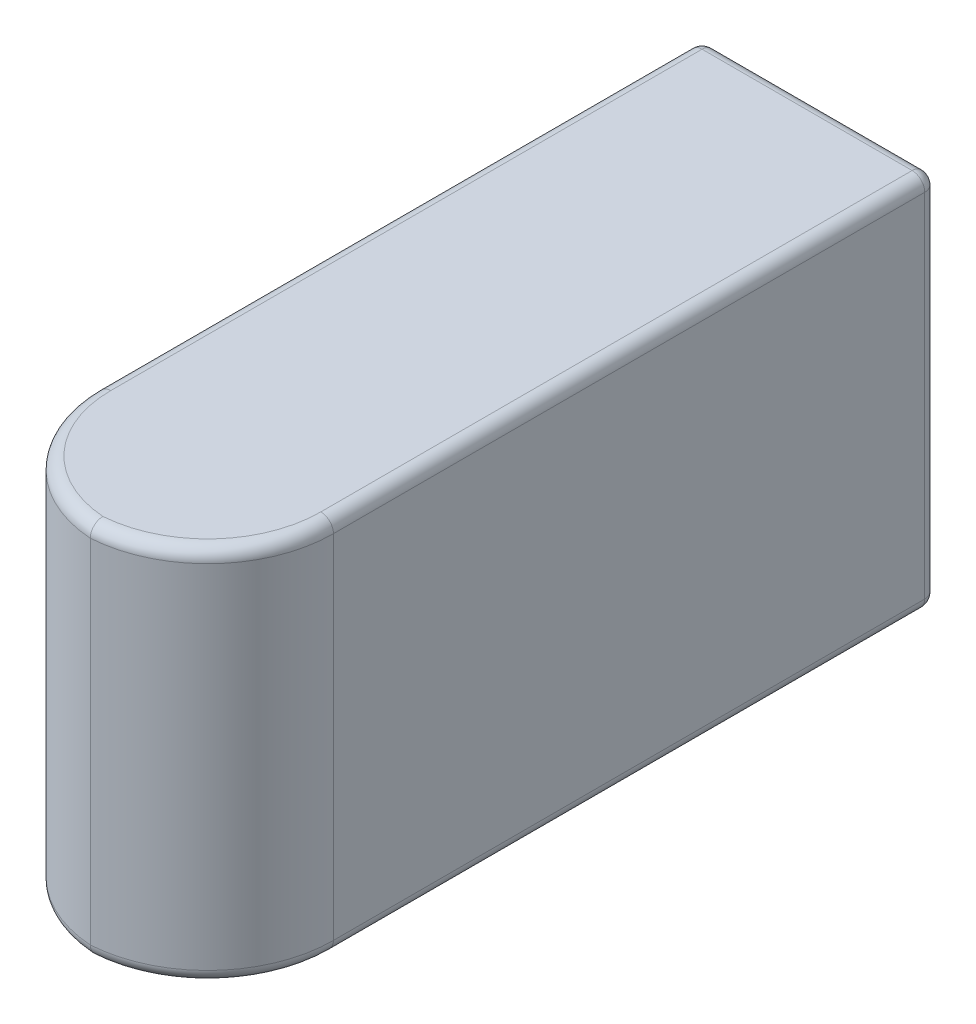
ISO-10303-21;
HEADER;
FILE_DESCRIPTION(('STEP AP214'),'2;1');
FILE_NAME('part.step','',(''),(''),'','','');
FILE_SCHEMA(('AUTOMOTIVE_DESIGN { 1 0 10303 214 1 1 1 1 }'));
ENDSEC;
DATA;
#1=APPLICATION_CONTEXT('core data for automotive mechanical design processes');
#2=APPLICATION_PROTOCOL_DEFINITION('international standard','automotive_design',2000,#1);
#3=PRODUCT_CONTEXT('',#1,'mechanical');
#4=PRODUCT('Part','Part','',(#3));
#5=PRODUCT_RELATED_PRODUCT_CATEGORY('part','',(#4));
#6=PRODUCT_DEFINITION_FORMATION('','',#4);
#7=PRODUCT_DEFINITION_CONTEXT('part definition',#1,'design');
#8=PRODUCT_DEFINITION('design','',#6,#7);
#9=PRODUCT_DEFINITION_SHAPE('','',#8);
#10=(LENGTH_UNIT() NAMED_UNIT(*) SI_UNIT(.MILLI.,.METRE.));
#11=(NAMED_UNIT(*) PLANE_ANGLE_UNIT() SI_UNIT($,.RADIAN.));
#12=(NAMED_UNIT(*) SI_UNIT($,.STERADIAN.) SOLID_ANGLE_UNIT());
#13=UNCERTAINTY_MEASURE_WITH_UNIT(LENGTH_MEASURE(1.E-05),#10,'distance_accuracy_value','');
#14=(GEOMETRIC_REPRESENTATION_CONTEXT(3) GLOBAL_UNCERTAINTY_ASSIGNED_CONTEXT((#13)) GLOBAL_UNIT_ASSIGNED_CONTEXT((#10,
#11,#12)) REPRESENTATION_CONTEXT('',''));
#15=CARTESIAN_POINT('',(0.,0.,0.));
#16=DIRECTION('',(0.,0.,1.));
#17=DIRECTION('',(1.,0.,0.));
#18=AXIS2_PLACEMENT_3D('',#15,#16,#17);
#19=CARTESIAN_POINT('',(18.7,15.,29.));
#20=DIRECTION('',(0.,1.,0.));
#21=DIRECTION('',(0.,0.,1.));
#22=AXIS2_PLACEMENT_3D('',#19,#20,#21);
#23=PLANE('',#22);
#24=DIRECTION('',(0.,0.,-1.));
#25=VECTOR('',#24,1.);
#26=CARTESIAN_POINT('',(1.,15.,29.));
#27=LINE('',#26,#25);
#28=CARTESIAN_POINT('',(1.,15.,-28.));
#29=VERTEX_POINT('',#28);
#30=CARTESIAN_POINT('',(1.,15.,19.));
#31=VERTEX_POINT('',#30);
#32=EDGE_CURVE('E134',#29,#31,#27,.F.);
#33=ORIENTED_EDGE('',*,*,#32,.T.);
#34=CARTESIAN_POINT('',(10.,15.,19.));
#35=DIRECTION('',(0.,1.,0.));
#36=DIRECTION('',(0.,0.,1.));
#37=AXIS2_PLACEMENT_3D('',#34,#35,#36);
#38=CIRCLE('',#37,9.);
#39=CARTESIAN_POINT('',(9.34999999999998,15.,27.9764970896224));
#40=VERTEX_POINT('',#39);
#41=EDGE_CURVE('E214',#31,#40,#38,.T.);
#42=ORIENTED_EDGE('',*,*,#41,.T.);
#43=CARTESIAN_POINT('',(8.7,15.,19.));
#44=DIRECTION('',(0.,1.,0.));
#45=DIRECTION('',(0.,0.,1.));
#46=AXIS2_PLACEMENT_3D('',#43,#44,#45);
#47=CIRCLE('',#46,9.);
#48=CARTESIAN_POINT('',(17.7,15.,19.));
#49=VERTEX_POINT('',#48);
#50=EDGE_CURVE('E129',#40,#49,#47,.T.);
#51=ORIENTED_EDGE('',*,*,#50,.T.);
#52=DIRECTION('',(0.,0.,-1.));
#53=VECTOR('',#52,1.);
#54=CARTESIAN_POINT('',(17.7,15.,-29.));
#55=LINE('',#54,#53);
#56=CARTESIAN_POINT('',(17.7,15.,-28.));
#57=VERTEX_POINT('',#56);
#58=EDGE_CURVE('E123',#49,#57,#55,.T.);
#59=ORIENTED_EDGE('',*,*,#58,.T.);
#60=DIRECTION('',(-1.,0.,0.));
#61=VECTOR('',#60,1.);
#62=CARTESIAN_POINT('',(18.7,15.,-28.));
#63=LINE('',#62,#61);
#64=EDGE_CURVE('E125',#57,#29,#63,.T.);
#65=ORIENTED_EDGE('',*,*,#64,.T.);
#66=EDGE_LOOP('',(#33,#42,#51,#59,#65));
#67=FACE_BOUND('',#66,.T.);
#68=ADVANCED_FACE('F32',(#67),#23,.T.);
#69=CARTESIAN_POINT('',(18.7,-15.,29.));
#70=DIRECTION('',(0.,1.,0.));
#71=DIRECTION('',(0.,0.,1.));
#72=AXIS2_PLACEMENT_3D('',#69,#70,#71);
#73=PLANE('',#72);
#74=CARTESIAN_POINT('',(8.7,-15.,19.));
#75=DIRECTION('',(0.,1.,0.));
#76=DIRECTION('',(0.,0.,1.));
#77=AXIS2_PLACEMENT_3D('',#74,#75,#76);
#78=CIRCLE('',#77,9.);
#79=CARTESIAN_POINT('',(17.7,-15.,19.));
#80=VERTEX_POINT('',#79);
#81=CARTESIAN_POINT('',(9.35,-15.,27.9764970896224));
#82=VERTEX_POINT('',#81);
#83=EDGE_CURVE('E226',#80,#82,#78,.F.);
#84=ORIENTED_EDGE('',*,*,#83,.T.);
#85=CARTESIAN_POINT('',(10.,-15.,19.));
#86=DIRECTION('',(0.,1.,0.));
#87=DIRECTION('',(0.,0.,1.));
#88=AXIS2_PLACEMENT_3D('',#85,#86,#87);
#89=CIRCLE('',#88,9.);
#90=CARTESIAN_POINT('',(1.,-15.,19.));
#91=VERTEX_POINT('',#90);
#92=EDGE_CURVE('E228',#82,#91,#89,.F.);
#93=ORIENTED_EDGE('',*,*,#92,.T.);
#94=DIRECTION('',(0.,0.,-1.));
#95=VECTOR('',#94,1.);
#96=CARTESIAN_POINT('',(1.,-15.,-29.));
#97=LINE('',#96,#95);
#98=CARTESIAN_POINT('',(1.,-15.,-28.));
#99=VERTEX_POINT('',#98);
#100=EDGE_CURVE('E224',#91,#99,#97,.T.);
#101=ORIENTED_EDGE('',*,*,#100,.T.);
#102=DIRECTION('',(-1.,0.,0.));
#103=VECTOR('',#102,1.);
#104=CARTESIAN_POINT('',(18.7,-15.,-28.));
#105=LINE('',#104,#103);
#106=CARTESIAN_POINT('',(17.7,-15.,-28.));
#107=VERTEX_POINT('',#106);
#108=EDGE_CURVE('E220',#99,#107,#105,.F.);
#109=ORIENTED_EDGE('',*,*,#108,.T.);
#110=DIRECTION('',(0.,0.,-1.));
#111=VECTOR('',#110,1.);
#112=CARTESIAN_POINT('',(17.7,-15.,29.));
#113=LINE('',#112,#111);
#114=EDGE_CURVE('E222',#107,#80,#113,.F.);
#115=ORIENTED_EDGE('',*,*,#114,.T.);
#116=EDGE_LOOP('',(#84,#93,#101,#109,#115));
#117=FACE_BOUND('',#116,.T.);
#118=ADVANCED_FACE('F318',(#117),#73,.F.);
#119=CARTESIAN_POINT('',(18.7,15.,-29.));
#120=DIRECTION('',(0.,0.,-1.));
#121=DIRECTION('',(-1.,0.,0.));
#122=AXIS2_PLACEMENT_3D('',#119,#120,#121);
#123=PLANE('',#122);
#124=DIRECTION('',(0.,-1.,0.));
#125=VECTOR('',#124,1.);
#126=CARTESIAN_POINT('',(17.7,-15.,-29.));
#127=LINE('',#126,#125);
#128=CARTESIAN_POINT('',(17.7,14.,-29.));
#129=VERTEX_POINT('',#128);
#130=CARTESIAN_POINT('',(17.7,-14.,-29.));
#131=VERTEX_POINT('',#130);
#132=EDGE_CURVE('E45',#129,#131,#127,.T.);
#133=ORIENTED_EDGE('',*,*,#132,.T.);
#134=DIRECTION('',(-1.,0.,0.));
#135=VECTOR('',#134,1.);
#136=CARTESIAN_POINT('',(0.,-14.,-29.));
#137=LINE('',#136,#135);
#138=CARTESIAN_POINT('',(1.,-14.,-29.));
#139=VERTEX_POINT('',#138);
#140=EDGE_CURVE('E11',#131,#139,#137,.T.);
#141=ORIENTED_EDGE('',*,*,#140,.T.);
#142=DIRECTION('',(0.,-1.,0.));
#143=VECTOR('',#142,1.);
#144=CARTESIAN_POINT('',(1.,15.,-29.));
#145=LINE('',#144,#143);
#146=CARTESIAN_POINT('',(1.,14.,-29.));
#147=VERTEX_POINT('',#146);
#148=EDGE_CURVE('E246',#139,#147,#145,.F.);
#149=ORIENTED_EDGE('',*,*,#148,.T.);
#150=DIRECTION('',(-1.,0.,0.));
#151=VECTOR('',#150,1.);
#152=CARTESIAN_POINT('',(18.7,14.,-29.));
#153=LINE('',#152,#151);
#154=EDGE_CURVE('E56',#147,#129,#153,.F.);
#155=ORIENTED_EDGE('',*,*,#154,.T.);
#156=EDGE_LOOP('',(#133,#141,#149,#155));
#157=FACE_BOUND('',#156,.T.);
#158=ADVANCED_FACE('F323',(#157),#123,.T.);
#159=CARTESIAN_POINT('',(18.7,0.,0.));
#160=DIRECTION('',(-1.,0.,0.));
#161=DIRECTION('',(0.,0.,1.));
#162=AXIS2_PLACEMENT_3D('',#159,#160,#161);
#163=PLANE('',#162);
#164=DIRECTION('',(0.,-1.,0.));
#165=VECTOR('',#164,1.);
#166=CARTESIAN_POINT('',(18.7,0.,19.));
#167=LINE('',#166,#165);
#168=CARTESIAN_POINT('',(18.7,14.,19.));
#169=VERTEX_POINT('',#168);
#170=CARTESIAN_POINT('',(18.7,-14.,19.));
#171=VERTEX_POINT('',#170);
#172=EDGE_CURVE('E145',#169,#171,#167,.T.);
#173=ORIENTED_EDGE('',*,*,#172,.T.);
#174=DIRECTION('',(0.,0.,-1.));
#175=VECTOR('',#174,1.);
#176=CARTESIAN_POINT('',(18.7,-14.,0.));
#177=LINE('',#176,#175);
#178=CARTESIAN_POINT('',(18.7,-14.,-28.));
#179=VERTEX_POINT('',#178);
#180=EDGE_CURVE('E244',#171,#179,#177,.T.);
#181=ORIENTED_EDGE('',*,*,#180,.T.);
#182=DIRECTION('',(0.,-1.,0.));
#183=VECTOR('',#182,1.);
#184=CARTESIAN_POINT('',(18.7,15.,-28.));
#185=LINE('',#184,#183);
#186=CARTESIAN_POINT('',(18.7,14.,-28.));
#187=VERTEX_POINT('',#186);
#188=EDGE_CURVE('E241',#179,#187,#185,.F.);
#189=ORIENTED_EDGE('',*,*,#188,.T.);
#190=DIRECTION('',(0.,0.,-1.));
#191=VECTOR('',#190,1.);
#192=CARTESIAN_POINT('',(18.7,14.,19.));
#193=LINE('',#192,#191);
#194=EDGE_CURVE('E157',#187,#169,#193,.F.);
#195=ORIENTED_EDGE('',*,*,#194,.T.);
#196=EDGE_LOOP('',(#173,#181,#189,#195));
#197=FACE_BOUND('',#196,.T.);
#198=ADVANCED_FACE('F333',(#197),#163,.F.);
#199=CARTESIAN_POINT('',(0.,0.,0.));
#200=DIRECTION('',(-1.,0.,0.));
#201=DIRECTION('',(0.,0.,1.));
#202=AXIS2_PLACEMENT_3D('',#199,#200,#201);
#203=PLANE('',#202);
#204=DIRECTION('',(0.,-1.,0.));
#205=VECTOR('',#204,1.);
#206=CARTESIAN_POINT('',(0.,15.,19.));
#207=LINE('',#206,#205);
#208=CARTESIAN_POINT('',(0.,-14.,19.));
#209=VERTEX_POINT('',#208);
#210=CARTESIAN_POINT('',(0.,14.,19.));
#211=VERTEX_POINT('',#210);
#212=EDGE_CURVE('E202',#209,#211,#207,.F.);
#213=ORIENTED_EDGE('',*,*,#212,.T.);
#214=DIRECTION('',(0.,0.,-1.));
#215=VECTOR('',#214,1.);
#216=CARTESIAN_POINT('',(0.,14.,0.));
#217=LINE('',#216,#215);
#218=CARTESIAN_POINT('',(0.,14.,-28.));
#219=VERTEX_POINT('',#218);
#220=EDGE_CURVE('E239',#211,#219,#217,.T.);
#221=ORIENTED_EDGE('',*,*,#220,.T.);
#222=DIRECTION('',(0.,-1.,0.));
#223=VECTOR('',#222,1.);
#224=CARTESIAN_POINT('',(0.,0.,-28.));
#225=LINE('',#224,#223);
#226=CARTESIAN_POINT('',(0.,-14.,-28.));
#227=VERTEX_POINT('',#226);
#228=EDGE_CURVE('E235',#219,#227,#225,.T.);
#229=ORIENTED_EDGE('',*,*,#228,.T.);
#230=DIRECTION('',(0.,0.,-1.));
#231=VECTOR('',#230,1.);
#232=CARTESIAN_POINT('',(0.,-14.,19.));
#233=LINE('',#232,#231);
#234=EDGE_CURVE('E237',#227,#209,#233,.F.);
#235=ORIENTED_EDGE('',*,*,#234,.T.);
#236=EDGE_LOOP('',(#213,#221,#229,#235));
#237=FACE_BOUND('',#236,.T.);
#238=ADVANCED_FACE('F328',(#237),#203,.T.);
#239=CARTESIAN_POINT('',(8.7,0.,19.));
#240=DIRECTION('',(0.,-1.,0.));
#241=DIRECTION('',(0.,0.,-1.));
#242=AXIS2_PLACEMENT_3D('',#239,#240,#241);
#243=CYLINDRICAL_SURFACE('',#242,10.);
#244=DIRECTION('',(0.,-1.,0.));
#245=VECTOR('',#244,1.);
#246=CARTESIAN_POINT('',(9.35,0.,28.9788526394571));
#247=LINE('',#246,#245);
#248=CARTESIAN_POINT('',(9.35,-14.,28.9788526394571));
#249=VERTEX_POINT('',#248);
#250=CARTESIAN_POINT('',(9.35,14.,28.9788526394571));
#251=VERTEX_POINT('',#250);
#252=EDGE_CURVE('E196',#249,#251,#247,.F.);
#253=ORIENTED_EDGE('',*,*,#252,.F.);
#254=CARTESIAN_POINT('',(8.7,-14.,19.));
#255=DIRECTION('',(0.,1.,0.));
#256=DIRECTION('',(0.,0.,1.));
#257=AXIS2_PLACEMENT_3D('',#254,#255,#256);
#258=CIRCLE('',#257,10.);
#259=EDGE_CURVE('E233',#249,#171,#258,.T.);
#260=ORIENTED_EDGE('',*,*,#259,.T.);
#261=ORIENTED_EDGE('',*,*,#172,.F.);
#262=CARTESIAN_POINT('',(8.7,14.,19.));
#263=DIRECTION('',(0.,1.,0.));
#264=DIRECTION('',(0.,0.,1.));
#265=AXIS2_PLACEMENT_3D('',#262,#263,#264);
#266=CIRCLE('',#265,10.);
#267=EDGE_CURVE('E231',#169,#251,#266,.F.);
#268=ORIENTED_EDGE('',*,*,#267,.T.);
#269=EDGE_LOOP('',(#253,#260,#261,#268));
#270=FACE_BOUND('',#269,.T.);
#271=ADVANCED_FACE('F315',(#270),#243,.T.);
#272=CARTESIAN_POINT('',(10.,15.,19.));
#273=DIRECTION('',(0.,1.,0.));
#274=DIRECTION('',(0.,0.,1.));
#275=AXIS2_PLACEMENT_3D('',#272,#273,#274);
#276=CYLINDRICAL_SURFACE('',#275,10.);
#277=ORIENTED_EDGE('',*,*,#252,.T.);
#278=CARTESIAN_POINT('',(10.,14.,19.));
#279=DIRECTION('',(0.,1.,0.));
#280=DIRECTION('',(0.,0.,1.));
#281=AXIS2_PLACEMENT_3D('',#278,#279,#280);
#282=CIRCLE('',#281,10.);
#283=EDGE_CURVE('E218',#251,#211,#282,.F.);
#284=ORIENTED_EDGE('',*,*,#283,.T.);
#285=ORIENTED_EDGE('',*,*,#212,.F.);
#286=CARTESIAN_POINT('',(10.,-14.,19.));
#287=DIRECTION('',(0.,1.,0.));
#288=DIRECTION('',(0.,0.,1.));
#289=AXIS2_PLACEMENT_3D('',#286,#287,#288);
#290=CIRCLE('',#289,10.);
#291=EDGE_CURVE('E216',#209,#249,#290,.T.);
#292=ORIENTED_EDGE('',*,*,#291,.T.);
#293=EDGE_LOOP('',(#277,#284,#285,#292));
#294=FACE_BOUND('',#293,.T.);
#295=ADVANCED_FACE('F309',(#294),#276,.T.);
#296=CARTESIAN_POINT('',(8.7,-14.,19.));
#297=DIRECTION('',(0.,1.,0.));
#298=DIRECTION('',(0.,0.,1.));
#299=AXIS2_PLACEMENT_3D('',#296,#297,#298);
#300=TOROIDAL_SURFACE('',#299,9.,1.);
#301=CARTESIAN_POINT('',(17.7,-14.,19.));
#302=DIRECTION('',(0.,0.,-1.));
#303=DIRECTION('',(-1.,0.,0.));
#304=AXIS2_PLACEMENT_3D('',#301,#302,#303);
#305=CIRCLE('',#304,1.);
#306=EDGE_CURVE('E189',#171,#80,#305,.T.);
#307=ORIENTED_EDGE('',*,*,#306,.F.);
#308=ORIENTED_EDGE('',*,*,#259,.F.);
#309=CARTESIAN_POINT('',(9.35,-14.,28.9788526394571));
#310=CARTESIAN_POINT('',(9.35,-14.0280892425908,28.9788524800863));
#311=CARTESIAN_POINT('',(9.35,-14.0561650138805,28.9776658761827));
#312=CARTESIAN_POINT('',(9.35,-14.1121153630422,28.9729322216136));
#313=CARTESIAN_POINT('',(9.35,-14.1399899512364,28.9693852929342));
#314=CARTESIAN_POINT('',(9.35,-14.2229642736295,28.9552379582422));
#315=CARTESIAN_POINT('',(9.35,-14.2775076878789,28.9411309093713));
#316=CARTESIAN_POINT('',(9.35,-14.383449333894,28.9039619110146));
#317=CARTESIAN_POINT('',(9.35,-14.4348461127187,28.8808958603273));
#318=CARTESIAN_POINT('',(9.35,-14.5330382390107,28.8264732757339));
#319=CARTESIAN_POINT('',(9.35,-14.5798346039287,28.7951185806704));
#320=CARTESIAN_POINT('',(9.35,-14.6675460231758,28.7249836815476));
#321=CARTESIAN_POINT('',(9.35,-14.70845618527,28.6861973625091));
#322=CARTESIAN_POINT('',(9.35,-14.7832145543902,28.6023044281414));
#323=CARTESIAN_POINT('',(9.35,-14.8170603468562,28.5571956606132));
#324=CARTESIAN_POINT('',(9.35,-14.8767928595188,28.4618466007571));
#325=CARTESIAN_POINT('',(9.35,-14.902661042676,28.4115947129186));
#326=CARTESIAN_POINT('',(9.35,-14.9455936512376,28.3074877031254));
#327=CARTESIAN_POINT('',(9.35,-14.9626657085774,28.2536357507527));
#328=CARTESIAN_POINT('',(9.35,-14.9827691656903,28.1650260708795));
#329=CARTESIAN_POINT('',(9.35,-14.9886753590449,28.1308905023525));
#330=CARTESIAN_POINT('',(9.35,-14.9969324404694,28.062225472734));
#331=CARTESIAN_POINT('',(9.35,-14.999288738448,28.0276966919692));
#332=CARTESIAN_POINT('',(9.35,-14.9999540655291,27.9876055183677));
#333=CARTESIAN_POINT('',(9.35,-15.0000001219606,27.9820509620599));
#334=CARTESIAN_POINT('',(9.35,-15.,27.9764970896224));
#335=B_SPLINE_CURVE_WITH_KNOTS('',3,(#309,#310,#311,#312,#313,#314,#315,#316,#317,#318,#319,
#320,#321,#322,#323,#324,#325,#326,#327,#328,#329,#330,#331,#332,#333,#334),.UNSPECIFIED.,.F.,
.F.,(4,2,2,2,2,2,2,2,2,2,2,2,4),(0.,0.0842159212963468,0.168427490491813,0.336574821098398,
0.504799216138045,0.672986321730692,0.841312416046296,1.0096959493569,1.17846784645353,
1.34709306141514,1.45086373486464,1.55447610512103,1.57113945446753),.UNSPECIFIED.);
#336=EDGE_CURVE('E37',#82,#249,#335,.F.);
#337=ORIENTED_EDGE('',*,*,#336,.F.);
#338=ORIENTED_EDGE('',*,*,#83,.F.);
#339=EDGE_LOOP('',(#307,#308,#337,#338));
#340=FACE_BOUND('',#339,.T.);
#341=ADVANCED_FACE('F306',(#340),#300,.T.);
#342=CARTESIAN_POINT('',(10.,-14.,19.));
#343=DIRECTION('',(0.,1.,0.));
#344=DIRECTION('',(0.,0.,1.));
#345=AXIS2_PLACEMENT_3D('',#342,#343,#344);
#346=TOROIDAL_SURFACE('',#345,9.,1.);
#347=ORIENTED_EDGE('',*,*,#336,.T.);
#348=ORIENTED_EDGE('',*,*,#291,.F.);
#349=CARTESIAN_POINT('',(1.,-14.,19.));
#350=DIRECTION('',(0.,0.,-1.));
#351=DIRECTION('',(-1.,0.,0.));
#352=AXIS2_PLACEMENT_3D('',#349,#350,#351);
#353=CIRCLE('',#352,1.);
#354=EDGE_CURVE('E187',#91,#209,#353,.T.);
#355=ORIENTED_EDGE('',*,*,#354,.F.);
#356=ORIENTED_EDGE('',*,*,#92,.F.);
#357=EDGE_LOOP('',(#347,#348,#355,#356));
#358=FACE_BOUND('',#357,.T.);
#359=ADVANCED_FACE('F34',(#358),#346,.T.);
#360=CARTESIAN_POINT('',(17.7,-14.,0.));
#361=DIRECTION('',(0.,0.,-1.));
#362=DIRECTION('',(-1.,0.,0.));
#363=AXIS2_PLACEMENT_3D('',#360,#361,#362);
#364=CYLINDRICAL_SURFACE('',#363,1.);
#365=ORIENTED_EDGE('',*,*,#306,.T.);
#366=ORIENTED_EDGE('',*,*,#114,.F.);
#367=CARTESIAN_POINT('',(17.7,-14.,-28.));
#368=DIRECTION('',(0.,0.,-1.));
#369=DIRECTION('',(-1.,0.,0.));
#370=AXIS2_PLACEMENT_3D('',#367,#368,#369);
#371=CIRCLE('',#370,1.);
#372=EDGE_CURVE('E181',#179,#107,#371,.T.);
#373=ORIENTED_EDGE('',*,*,#372,.F.);
#374=ORIENTED_EDGE('',*,*,#180,.F.);
#375=EDGE_LOOP('',(#365,#366,#373,#374));
#376=FACE_BOUND('',#375,.T.);
#377=ADVANCED_FACE('F303',(#376),#364,.T.);
#378=CARTESIAN_POINT('',(1.,-14.,29.));
#379=DIRECTION('',(0.,0.,1.));
#380=DIRECTION('',(1.,0.,0.));
#381=AXIS2_PLACEMENT_3D('',#378,#379,#380);
#382=CYLINDRICAL_SURFACE('',#381,1.);
#383=ORIENTED_EDGE('',*,*,#354,.T.);
#384=ORIENTED_EDGE('',*,*,#234,.F.);
#385=CARTESIAN_POINT('',(1.,-14.,-28.));
#386=DIRECTION('',(0.,0.,-1.));
#387=DIRECTION('',(-1.,0.,0.));
#388=AXIS2_PLACEMENT_3D('',#385,#386,#387);
#389=CIRCLE('',#388,1.);
#390=EDGE_CURVE('E178',#99,#227,#389,.T.);
#391=ORIENTED_EDGE('',*,*,#390,.F.);
#392=ORIENTED_EDGE('',*,*,#100,.F.);
#393=EDGE_LOOP('',(#383,#384,#391,#392));
#394=FACE_BOUND('',#393,.T.);
#395=ADVANCED_FACE('F299',(#394),#382,.T.);
#396=CARTESIAN_POINT('',(18.7,-14.,-28.));
#397=DIRECTION('',(1.,0.,0.));
#398=DIRECTION('',(0.,0.,-1.));
#399=AXIS2_PLACEMENT_3D('',#396,#397,#398);
#400=CYLINDRICAL_SURFACE('',#399,1.);
#401=CARTESIAN_POINT('',(17.7,-14.,-28.));
#402=DIRECTION('',(1.,0.,0.));
#403=DIRECTION('',(0.,0.,-1.));
#404=AXIS2_PLACEMENT_3D('',#401,#402,#403);
#405=CIRCLE('',#404,1.);
#406=EDGE_CURVE('E184',#107,#131,#405,.T.);
#407=ORIENTED_EDGE('',*,*,#406,.F.);
#408=ORIENTED_EDGE('',*,*,#108,.F.);
#409=CARTESIAN_POINT('',(1.,-14.,-28.));
#410=DIRECTION('',(-1.,0.,0.));
#411=DIRECTION('',(0.,-1.,0.));
#412=AXIS2_PLACEMENT_3D('',#409,#410,#411);
#413=CIRCLE('',#412,1.);
#414=EDGE_CURVE('E175',#139,#99,#413,.T.);
#415=ORIENTED_EDGE('',*,*,#414,.F.);
#416=ORIENTED_EDGE('',*,*,#140,.F.);
#417=EDGE_LOOP('',(#407,#408,#415,#416));
#418=FACE_BOUND('',#417,.T.);
#419=ADVANCED_FACE('F295',(#418),#400,.T.);
#420=CARTESIAN_POINT('',(17.7,-14.,-28.));
#421=DIRECTION('',(0.,0.,1.));
#422=DIRECTION('',(1.,0.,0.));
#423=AXIS2_PLACEMENT_3D('',#420,#421,#422);
#424=SPHERICAL_SURFACE('',#423,1.);
#425=ORIENTED_EDGE('',*,*,#372,.T.);
#426=ORIENTED_EDGE('',*,*,#406,.T.);
#427=CARTESIAN_POINT('',(17.7,-14.,-28.));
#428=DIRECTION('',(0.,-1.,0.));
#429=DIRECTION('',(1.,0.,0.));
#430=AXIS2_PLACEMENT_3D('',#427,#428,#429);
#431=CIRCLE('',#430,1.);
#432=EDGE_CURVE('E172',#179,#131,#431,.F.);
#433=ORIENTED_EDGE('',*,*,#432,.F.);
#434=EDGE_LOOP('',(#425,#426,#433));
#435=FACE_BOUND('',#434,.T.);
#436=ADVANCED_FACE('F291',(#435),#424,.T.);
#437=CARTESIAN_POINT('',(1.,-14.,-28.));
#438=DIRECTION('',(0.,0.,1.));
#439=DIRECTION('',(1.,0.,0.));
#440=AXIS2_PLACEMENT_3D('',#437,#438,#439);
#441=SPHERICAL_SURFACE('',#440,1.);
#442=ORIENTED_EDGE('',*,*,#414,.T.);
#443=ORIENTED_EDGE('',*,*,#390,.T.);
#444=CARTESIAN_POINT('',(1.,-14.,-28.));
#445=DIRECTION('',(0.,-1.,0.));
#446=DIRECTION('',(0.,0.,-1.));
#447=AXIS2_PLACEMENT_3D('',#444,#445,#446);
#448=CIRCLE('',#447,1.);
#449=EDGE_CURVE('E154',#139,#227,#448,.F.);
#450=ORIENTED_EDGE('',*,*,#449,.F.);
#451=EDGE_LOOP('',(#442,#443,#450));
#452=FACE_BOUND('',#451,.T.);
#453=ADVANCED_FACE('F287',(#452),#441,.T.);
#454=CARTESIAN_POINT('',(17.7,15.,-28.));
#455=DIRECTION('',(0.,1.,0.));
#456=DIRECTION('',(0.,0.,1.));
#457=AXIS2_PLACEMENT_3D('',#454,#455,#456);
#458=CYLINDRICAL_SURFACE('',#457,1.);
#459=ORIENTED_EDGE('',*,*,#432,.T.);
#460=ORIENTED_EDGE('',*,*,#132,.F.);
#461=CARTESIAN_POINT('',(17.7,14.,-28.));
#462=DIRECTION('',(0.,1.,0.));
#463=DIRECTION('',(0.,0.,1.));
#464=AXIS2_PLACEMENT_3D('',#461,#462,#463);
#465=CIRCLE('',#464,1.);
#466=EDGE_CURVE('E153',#187,#129,#465,.T.);
#467=ORIENTED_EDGE('',*,*,#466,.F.);
#468=ORIENTED_EDGE('',*,*,#188,.F.);
#469=EDGE_LOOP('',(#459,#460,#467,#468));
#470=FACE_BOUND('',#469,.T.);
#471=ADVANCED_FACE('F283',(#470),#458,.T.);
#472=CARTESIAN_POINT('',(1.,0.,-28.));
#473=DIRECTION('',(0.,-1.,0.));
#474=DIRECTION('',(0.,0.,-1.));
#475=AXIS2_PLACEMENT_3D('',#472,#473,#474);
#476=CYLINDRICAL_SURFACE('',#475,1.);
#477=ORIENTED_EDGE('',*,*,#449,.T.);
#478=ORIENTED_EDGE('',*,*,#228,.F.);
#479=CARTESIAN_POINT('',(1.,14.,-28.));
#480=DIRECTION('',(0.,1.,0.));
#481=DIRECTION('',(0.,0.,1.));
#482=AXIS2_PLACEMENT_3D('',#479,#480,#481);
#483=CIRCLE('',#482,1.);
#484=EDGE_CURVE('E160',#147,#219,#483,.T.);
#485=ORIENTED_EDGE('',*,*,#484,.F.);
#486=ORIENTED_EDGE('',*,*,#148,.F.);
#487=EDGE_LOOP('',(#477,#478,#485,#486));
#488=FACE_BOUND('',#487,.T.);
#489=ADVANCED_FACE('F280',(#488),#476,.T.);
#490=CARTESIAN_POINT('',(18.7,14.,-28.));
#491=DIRECTION('',(-1.,0.,0.));
#492=DIRECTION('',(0.,0.,1.));
#493=AXIS2_PLACEMENT_3D('',#490,#491,#492);
#494=CYLINDRICAL_SURFACE('',#493,1.);
#495=CARTESIAN_POINT('',(17.7,14.,-28.));
#496=DIRECTION('',(1.,0.,0.));
#497=DIRECTION('',(0.,0.,-1.));
#498=AXIS2_PLACEMENT_3D('',#495,#496,#497);
#499=CIRCLE('',#498,1.);
#500=EDGE_CURVE('E140',#129,#57,#499,.T.);
#501=ORIENTED_EDGE('',*,*,#500,.F.);
#502=ORIENTED_EDGE('',*,*,#154,.F.);
#503=CARTESIAN_POINT('',(1.,14.,-28.));
#504=DIRECTION('',(-1.,0.,0.));
#505=DIRECTION('',(0.,0.,1.));
#506=AXIS2_PLACEMENT_3D('',#503,#504,#505);
#507=CIRCLE('',#506,1.);
#508=EDGE_CURVE('E143',#29,#147,#507,.T.);
#509=ORIENTED_EDGE('',*,*,#508,.F.);
#510=ORIENTED_EDGE('',*,*,#64,.F.);
#511=EDGE_LOOP('',(#501,#502,#509,#510));
#512=FACE_BOUND('',#511,.T.);
#513=ADVANCED_FACE('F139',(#512),#494,.T.);
#514=CARTESIAN_POINT('',(17.7,14.,-28.));
#515=DIRECTION('',(0.,0.,1.));
#516=DIRECTION('',(1.,0.,0.));
#517=AXIS2_PLACEMENT_3D('',#514,#515,#516);
#518=SPHERICAL_SURFACE('',#517,1.);
#519=ORIENTED_EDGE('',*,*,#466,.T.);
#520=ORIENTED_EDGE('',*,*,#500,.T.);
#521=CARTESIAN_POINT('',(17.7,14.,-28.));
#522=DIRECTION('',(0.,0.,-1.));
#523=DIRECTION('',(-1.,0.,0.));
#524=AXIS2_PLACEMENT_3D('',#521,#522,#523);
#525=CIRCLE('',#524,1.);
#526=EDGE_CURVE('E150',#187,#57,#525,.F.);
#527=ORIENTED_EDGE('',*,*,#526,.F.);
#528=EDGE_LOOP('',(#519,#520,#527));
#529=FACE_BOUND('',#528,.T.);
#530=ADVANCED_FACE('F149',(#529),#518,.T.);
#531=CARTESIAN_POINT('',(1.,14.,-28.));
#532=DIRECTION('',(0.,0.,1.));
#533=DIRECTION('',(1.,0.,0.));
#534=AXIS2_PLACEMENT_3D('',#531,#532,#533);
#535=SPHERICAL_SURFACE('',#534,1.);
#536=ORIENTED_EDGE('',*,*,#508,.T.);
#537=ORIENTED_EDGE('',*,*,#484,.T.);
#538=CARTESIAN_POINT('',(1.,14.,-28.));
#539=DIRECTION('',(0.,0.,-1.));
#540=DIRECTION('',(-1.,0.,0.));
#541=AXIS2_PLACEMENT_3D('',#538,#539,#540);
#542=CIRCLE('',#541,1.);
#543=EDGE_CURVE('E158',#29,#219,#542,.F.);
#544=ORIENTED_EDGE('',*,*,#543,.F.);
#545=EDGE_LOOP('',(#536,#537,#544));
#546=FACE_BOUND('',#545,.T.);
#547=ADVANCED_FACE('F272',(#546),#535,.T.);
#548=CARTESIAN_POINT('',(17.7,14.,29.));
#549=DIRECTION('',(0.,0.,1.));
#550=DIRECTION('',(1.,0.,0.));
#551=AXIS2_PLACEMENT_3D('',#548,#549,#550);
#552=CYLINDRICAL_SURFACE('',#551,1.);
#553=ORIENTED_EDGE('',*,*,#526,.T.);
#554=ORIENTED_EDGE('',*,*,#58,.F.);
#555=CARTESIAN_POINT('',(17.7,14.,19.));
#556=DIRECTION('',(0.,0.,1.));
#557=DIRECTION('',(1.,0.,0.));
#558=AXIS2_PLACEMENT_3D('',#555,#556,#557);
#559=CIRCLE('',#558,1.);
#560=EDGE_CURVE('E163',#169,#49,#559,.T.);
#561=ORIENTED_EDGE('',*,*,#560,.F.);
#562=ORIENTED_EDGE('',*,*,#194,.F.);
#563=EDGE_LOOP('',(#553,#554,#561,#562));
#564=FACE_BOUND('',#563,.T.);
#565=ADVANCED_FACE('F156',(#564),#552,.T.);
#566=CARTESIAN_POINT('',(1.,14.,0.));
#567=DIRECTION('',(0.,0.,-1.));
#568=DIRECTION('',(-1.,0.,0.));
#569=AXIS2_PLACEMENT_3D('',#566,#567,#568);
#570=CYLINDRICAL_SURFACE('',#569,1.);
#571=ORIENTED_EDGE('',*,*,#543,.T.);
#572=ORIENTED_EDGE('',*,*,#220,.F.);
#573=CARTESIAN_POINT('',(1.,14.,19.));
#574=DIRECTION('',(0.,0.,1.));
#575=DIRECTION('',(1.,0.,0.));
#576=AXIS2_PLACEMENT_3D('',#573,#574,#575);
#577=CIRCLE('',#576,1.);
#578=EDGE_CURVE('E257',#31,#211,#577,.T.);
#579=ORIENTED_EDGE('',*,*,#578,.F.);
#580=ORIENTED_EDGE('',*,*,#32,.F.);
#581=EDGE_LOOP('',(#571,#572,#579,#580));
#582=FACE_BOUND('',#581,.T.);
#583=ADVANCED_FACE('F265',(#582),#570,.T.);
#584=CARTESIAN_POINT('',(8.7,14.,19.));
#585=DIRECTION('',(0.,1.,0.));
#586=DIRECTION('',(0.,0.,1.));
#587=AXIS2_PLACEMENT_3D('',#584,#585,#586);
#588=TOROIDAL_SURFACE('',#587,9.,1.);
#589=ORIENTED_EDGE('',*,*,#560,.T.);
#590=ORIENTED_EDGE('',*,*,#50,.F.);
#591=CARTESIAN_POINT('',(9.35,14.,28.9788526394571));
#592=CARTESIAN_POINT('',(9.34999999999998,14.0280892425908,28.9788524800863));
#593=CARTESIAN_POINT('',(9.34999999999997,14.0561650138805,28.9776658761827));
#594=CARTESIAN_POINT('',(9.34999999999997,14.1121153630422,28.9729322216136));
#595=CARTESIAN_POINT('',(9.34999999999997,14.1399899512364,28.9693852929342));
#596=CARTESIAN_POINT('',(9.34999999999998,14.2229642736295,28.9552379582422));
#597=CARTESIAN_POINT('',(9.34999999999997,14.2775076878789,28.9411309093713));
#598=CARTESIAN_POINT('',(9.34999999999996,14.383449333894,28.9039619110146));
#599=CARTESIAN_POINT('',(9.34999999999996,14.4348461127187,28.8808958603273));
#600=CARTESIAN_POINT('',(9.34999999999997,14.5330382390107,28.8264732757339));
#601=CARTESIAN_POINT('',(9.34999999999997,14.5798346039287,28.7951185806704));
#602=CARTESIAN_POINT('',(9.34999999999997,14.6675460231758,28.7249836815476));
#603=CARTESIAN_POINT('',(9.34999999999997,14.70845618527,28.6861973625091));
#604=CARTESIAN_POINT('',(9.34999999999998,14.7832145543902,28.6023044281414));
#605=CARTESIAN_POINT('',(9.34999999999999,14.8170603468562,28.5571956606132));
#606=CARTESIAN_POINT('',(9.34999999999998,14.8767928595188,28.4618466007571));
#607=CARTESIAN_POINT('',(9.34999999999997,14.902661042676,28.4115947129186));
#608=CARTESIAN_POINT('',(9.34999999999997,14.9455936512376,28.3074877031254));
#609=CARTESIAN_POINT('',(9.34999999999997,14.9626657085774,28.2536357507527));
#610=CARTESIAN_POINT('',(9.34999999999998,14.9827691656903,28.1650260708795));
#611=CARTESIAN_POINT('',(9.34999999999998,14.9886753590449,28.1308905023525));
#612=CARTESIAN_POINT('',(9.34999999999996,14.9969324404694,28.062225472734));
#613=CARTESIAN_POINT('',(9.34999999999994,14.999288738448,28.0276966919692));
#614=CARTESIAN_POINT('',(9.34999999999997,14.9999540655291,27.9876055183677));
#615=CARTESIAN_POINT('',(9.34999999999997,15.0000001219606,27.9820509620599));
#616=CARTESIAN_POINT('',(9.34999999999998,15.,27.9764970896224));
#617=B_SPLINE_CURVE_WITH_KNOTS('',3,(#591,#592,#593,#594,#595,#596,#597,#598,#599,#600,#601,
#602,#603,#604,#605,#606,#607,#608,#609,#610,#611,#612,#613,#614,#615,#616),.UNSPECIFIED.,.F.,
.F.,(4,2,2,2,2,2,2,2,2,2,2,2,4),(0.,0.0842159212963467,0.168427490491811,0.336574821098396,
0.50479921613804,0.672986321730689,0.841312416046295,1.0096959493569,1.17846784645353,
1.34709306141514,1.45086373486464,1.55447610512104,1.57113945446754),.UNSPECIFIED.);
#618=EDGE_CURVE('E250',#251,#40,#617,.T.);
#619=ORIENTED_EDGE('',*,*,#618,.F.);
#620=ORIENTED_EDGE('',*,*,#267,.F.);
#621=EDGE_LOOP('',(#589,#590,#619,#620));
#622=FACE_BOUND('',#621,.T.);
#623=ADVANCED_FACE('F261',(#622),#588,.T.);
#624=CARTESIAN_POINT('',(10.,14.,19.));
#625=DIRECTION('',(0.,1.,0.));
#626=DIRECTION('',(0.,0.,1.));
#627=AXIS2_PLACEMENT_3D('',#624,#625,#626);
#628=TOROIDAL_SURFACE('',#627,9.,1.);
#629=ORIENTED_EDGE('',*,*,#578,.T.);
#630=ORIENTED_EDGE('',*,*,#283,.F.);
#631=ORIENTED_EDGE('',*,*,#618,.T.);
#632=ORIENTED_EDGE('',*,*,#41,.F.);
#633=EDGE_LOOP('',(#629,#630,#631,#632));
#634=FACE_BOUND('',#633,.T.);
#635=ADVANCED_FACE('F258',(#634),#628,.T.);
#636=CLOSED_SHELL('',(#68,#118,#158,#198,#238,#271,#295,#341,#359,#377,#395,#419,#436,#453,#471,
#489,#513,#530,#547,#565,#583,#623,#635));
#637=MANIFOLD_SOLID_BREP('B2',#636);
#638=ADVANCED_BREP_SHAPE_REPRESENTATION('',(#18,#637),#14);
#639=SHAPE_DEFINITION_REPRESENTATION(#9,#638);
ENDSEC;
END-ISO-10303-21;
